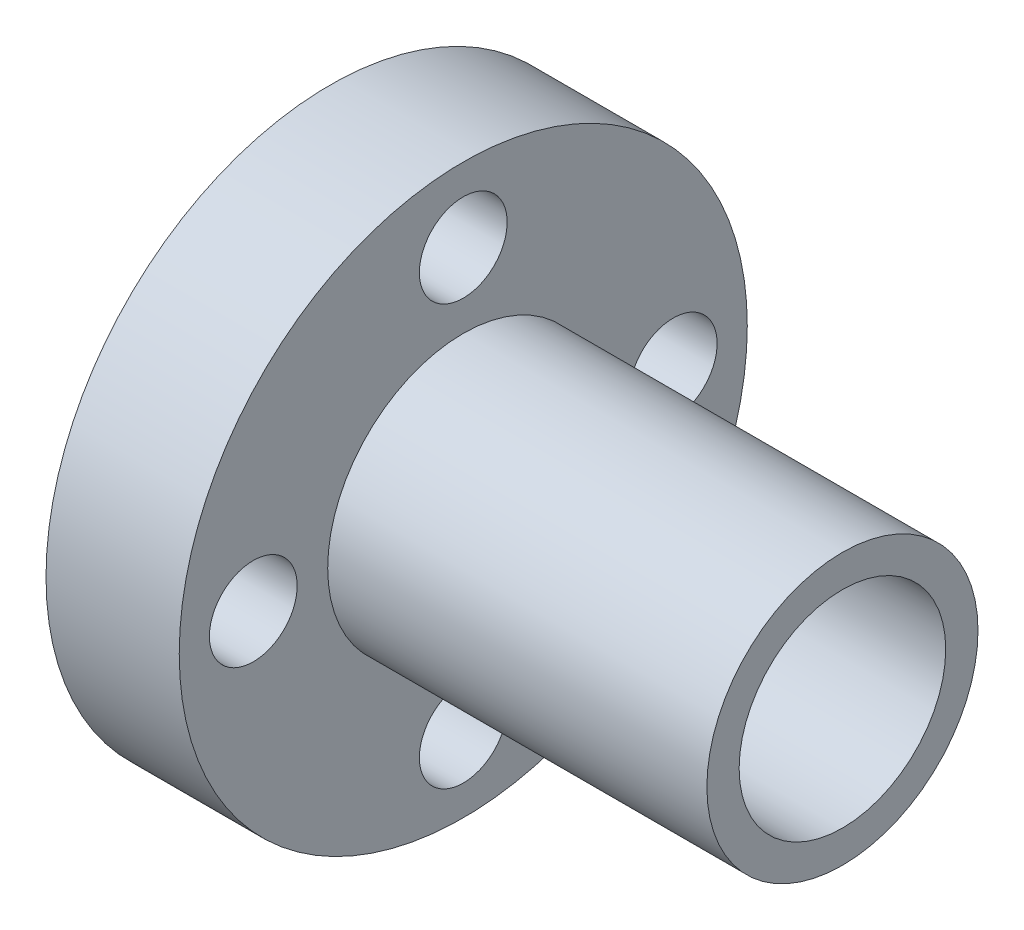
ISO-10303-21;
HEADER;
FILE_DESCRIPTION(('STEP AP214'),'2;1');
FILE_NAME('part.step','',(''),(''),'','','');
FILE_SCHEMA(('AUTOMOTIVE_DESIGN { 1 0 10303 214 1 1 1 1 }'));
ENDSEC;
DATA;
#1=APPLICATION_CONTEXT('core data for automotive mechanical design processes');
#2=APPLICATION_PROTOCOL_DEFINITION('international standard','automotive_design',2000,#1);
#3=PRODUCT_CONTEXT('',#1,'mechanical');
#4=PRODUCT('Part','Part','',(#3));
#5=PRODUCT_RELATED_PRODUCT_CATEGORY('part','',(#4));
#6=PRODUCT_DEFINITION_FORMATION('','',#4);
#7=PRODUCT_DEFINITION_CONTEXT('part definition',#1,'design');
#8=PRODUCT_DEFINITION('design','',#6,#7);
#9=PRODUCT_DEFINITION_SHAPE('','',#8);
#10=(LENGTH_UNIT() NAMED_UNIT(*) SI_UNIT(.MILLI.,.METRE.));
#11=(NAMED_UNIT(*) PLANE_ANGLE_UNIT() SI_UNIT($,.RADIAN.));
#12=(NAMED_UNIT(*) SI_UNIT($,.STERADIAN.) SOLID_ANGLE_UNIT());
#13=UNCERTAINTY_MEASURE_WITH_UNIT(LENGTH_MEASURE(1.E-05),#10,'distance_accuracy_value','');
#14=(GEOMETRIC_REPRESENTATION_CONTEXT(3) GLOBAL_UNCERTAINTY_ASSIGNED_CONTEXT((#13)) GLOBAL_UNIT_ASSIGNED_CONTEXT((#10,
#11,#12)) REPRESENTATION_CONTEXT('',''));
#15=CARTESIAN_POINT('',(0.,0.,0.));
#16=DIRECTION('',(0.,0.,1.));
#17=DIRECTION('',(1.,0.,0.));
#18=AXIS2_PLACEMENT_3D('',#15,#16,#17);
#19=CARTESIAN_POINT('',(5.159375,0.,0.));
#20=DIRECTION('',(1.,0.,0.));
#21=DIRECTION('',(0.,0.,-1.));
#22=AXIS2_PLACEMENT_3D('',#19,#20,#21);
#23=PLANE('',#22);
#24=CARTESIAN_POINT('',(5.159375,-8.1315,0.));
#25=DIRECTION('',(1.,0.,0.));
#26=DIRECTION('',(0.,0.,-1.));
#27=AXIS2_PLACEMENT_3D('',#24,#25,#26);
#28=CIRCLE('',#27,1.7);
#29=CARTESIAN_POINT('',(5.159375,-8.1315,1.7));
#30=VERTEX_POINT('',#29);
#31=EDGE_CURVE('E61',#30,#30,#28,.T.);
#32=ORIENTED_EDGE('',*,*,#31,.F.);
#33=EDGE_LOOP('',(#32));
#34=FACE_BOUND('',#33,.T.);
#35=CARTESIAN_POINT('',(5.159375,8.1315,0.));
#36=DIRECTION('',(1.,0.,0.));
#37=DIRECTION('',(0.,0.,-1.));
#38=AXIS2_PLACEMENT_3D('',#35,#36,#37);
#39=CIRCLE('',#38,1.7);
#40=CARTESIAN_POINT('',(5.159375,8.1315,1.7));
#41=VERTEX_POINT('',#40);
#42=EDGE_CURVE('E49',#41,#41,#39,.T.);
#43=ORIENTED_EDGE('',*,*,#42,.F.);
#44=EDGE_LOOP('',(#43));
#45=FACE_BOUND('',#44,.T.);
#46=CARTESIAN_POINT('',(5.159375,0.,0.));
#47=DIRECTION('',(1.,0.,0.));
#48=DIRECTION('',(0.,0.,-1.));
#49=AXIS2_PLACEMENT_3D('',#46,#47,#48);
#50=CIRCLE('',#49,5.25);
#51=CARTESIAN_POINT('',(5.159375,0.,5.25));
#52=VERTEX_POINT('',#51);
#53=EDGE_CURVE('E10',#52,#52,#50,.T.);
#54=ORIENTED_EDGE('',*,*,#53,.F.);
#55=EDGE_LOOP('',(#54));
#56=FACE_BOUND('',#55,.T.);
#57=CARTESIAN_POINT('',(5.159375,0.,0.));
#58=DIRECTION('',(1.,0.,0.));
#59=DIRECTION('',(0.,0.,-1.));
#60=AXIS2_PLACEMENT_3D('',#57,#58,#59);
#61=CIRCLE('',#60,11.);
#62=CARTESIAN_POINT('',(5.159375,0.,-11.));
#63=VERTEX_POINT('',#62);
#64=EDGE_CURVE('E40',#63,#63,#61,.T.);
#65=ORIENTED_EDGE('',*,*,#64,.T.);
#66=EDGE_LOOP('',(#65));
#67=FACE_BOUND('',#66,.T.);
#68=CARTESIAN_POINT('',(5.159375,0.,-8.1315));
#69=DIRECTION('',(1.,0.,0.));
#70=DIRECTION('',(0.,0.,-1.));
#71=AXIS2_PLACEMENT_3D('',#68,#69,#70);
#72=CIRCLE('',#71,1.7);
#73=CARTESIAN_POINT('',(5.159375,0.,-6.4315));
#74=VERTEX_POINT('',#73);
#75=EDGE_CURVE('E55',#74,#74,#72,.T.);
#76=ORIENTED_EDGE('',*,*,#75,.F.);
#77=EDGE_LOOP('',(#76));
#78=FACE_BOUND('',#77,.T.);
#79=CARTESIAN_POINT('',(5.159375,0.,8.1315));
#80=DIRECTION('',(1.,0.,0.));
#81=DIRECTION('',(0.,0.,-1.));
#82=AXIS2_PLACEMENT_3D('',#79,#80,#81);
#83=CIRCLE('',#82,1.7);
#84=CARTESIAN_POINT('',(5.159375,0.,9.8315));
#85=VERTEX_POINT('',#84);
#86=EDGE_CURVE('E67',#85,#85,#83,.T.);
#87=ORIENTED_EDGE('',*,*,#86,.F.);
#88=EDGE_LOOP('',(#87));
#89=FACE_BOUND('',#88,.T.);
#90=ADVANCED_FACE('F32',(#34,#45,#56,#67,#78,#89),#23,.T.);
#91=CARTESIAN_POINT('',(0.,0.,0.));
#92=DIRECTION('',(1.,0.,0.));
#93=DIRECTION('',(0.,0.,-1.));
#94=AXIS2_PLACEMENT_3D('',#91,#92,#93);
#95=PLANE('',#94);
#96=CARTESIAN_POINT('',(0.,0.,0.));
#97=DIRECTION('',(1.,0.,0.));
#98=DIRECTION('',(0.,0.,-1.));
#99=AXIS2_PLACEMENT_3D('',#96,#97,#98);
#100=CIRCLE('',#99,4.0005);
#101=CARTESIAN_POINT('',(0.,0.,-4.0005));
#102=VERTEX_POINT('',#101);
#103=EDGE_CURVE('E73',#102,#102,#100,.T.);
#104=ORIENTED_EDGE('',*,*,#103,.T.);
#105=EDGE_LOOP('',(#104));
#106=FACE_BOUND('',#105,.T.);
#107=CARTESIAN_POINT('',(0.,0.,0.));
#108=DIRECTION('',(1.,0.,0.));
#109=DIRECTION('',(0.,0.,-1.));
#110=AXIS2_PLACEMENT_3D('',#107,#108,#109);
#111=CIRCLE('',#110,11.);
#112=CARTESIAN_POINT('',(0.,0.,-11.));
#113=VERTEX_POINT('',#112);
#114=EDGE_CURVE('E36',#113,#113,#111,.T.);
#115=ORIENTED_EDGE('',*,*,#114,.F.);
#116=EDGE_LOOP('',(#115));
#117=FACE_BOUND('',#116,.T.);
#118=CARTESIAN_POINT('',(0.,8.1315,0.));
#119=DIRECTION('',(1.,0.,0.));
#120=DIRECTION('',(0.,0.,-1.));
#121=AXIS2_PLACEMENT_3D('',#118,#119,#120);
#122=CIRCLE('',#121,1.7);
#123=CARTESIAN_POINT('',(0.,8.1315,1.7));
#124=VERTEX_POINT('',#123);
#125=EDGE_CURVE('E52',#124,#124,#122,.T.);
#126=ORIENTED_EDGE('',*,*,#125,.T.);
#127=EDGE_LOOP('',(#126));
#128=FACE_BOUND('',#127,.T.);
#129=CARTESIAN_POINT('',(0.,0.,-8.1315));
#130=DIRECTION('',(1.,0.,0.));
#131=DIRECTION('',(0.,-1.,0.));
#132=AXIS2_PLACEMENT_3D('',#129,#130,#131);
#133=CIRCLE('',#132,1.7);
#134=CARTESIAN_POINT('',(0.,0.,-6.4315));
#135=VERTEX_POINT('',#134);
#136=EDGE_CURVE('E58',#135,#135,#133,.T.);
#137=ORIENTED_EDGE('',*,*,#136,.T.);
#138=EDGE_LOOP('',(#137));
#139=FACE_BOUND('',#138,.T.);
#140=CARTESIAN_POINT('',(0.,-8.1315,0.));
#141=DIRECTION('',(1.,0.,0.));
#142=DIRECTION('',(0.,0.,1.));
#143=AXIS2_PLACEMENT_3D('',#140,#141,#142);
#144=CIRCLE('',#143,1.7);
#145=CARTESIAN_POINT('',(0.,-8.1315,1.7));
#146=VERTEX_POINT('',#145);
#147=EDGE_CURVE('E64',#146,#146,#144,.T.);
#148=ORIENTED_EDGE('',*,*,#147,.T.);
#149=EDGE_LOOP('',(#148));
#150=FACE_BOUND('',#149,.T.);
#151=CARTESIAN_POINT('',(0.,0.,8.1315));
#152=DIRECTION('',(1.,0.,0.));
#153=DIRECTION('',(0.,1.,0.));
#154=AXIS2_PLACEMENT_3D('',#151,#152,#153);
#155=CIRCLE('',#154,1.7);
#156=CARTESIAN_POINT('',(0.,0.,9.8315));
#157=VERTEX_POINT('',#156);
#158=EDGE_CURVE('E70',#157,#157,#155,.T.);
#159=ORIENTED_EDGE('',*,*,#158,.T.);
#160=EDGE_LOOP('',(#159));
#161=FACE_BOUND('',#160,.T.);
#162=ADVANCED_FACE('F80',(#106,#117,#128,#139,#150,#161),#95,.F.);
#163=CARTESIAN_POINT('',(5.159375,0.,0.));
#164=DIRECTION('',(-1.,0.,0.));
#165=DIRECTION('',(0.,0.,1.));
#166=AXIS2_PLACEMENT_3D('',#163,#164,#165);
#167=CYLINDRICAL_SURFACE('',#166,11.);
#168=ORIENTED_EDGE('',*,*,#64,.F.);
#169=EDGE_LOOP('',(#168));
#170=FACE_BOUND('',#169,.T.);
#171=ORIENTED_EDGE('',*,*,#114,.T.);
#172=EDGE_LOOP('',(#171));
#173=FACE_BOUND('',#172,.T.);
#174=ADVANCED_FACE('F34',(#170,#173),#167,.T.);
#175=CARTESIAN_POINT('',(19.84375,0.,0.));
#176=DIRECTION('',(-1.,0.,0.));
#177=DIRECTION('',(0.,0.,1.));
#178=AXIS2_PLACEMENT_3D('',#175,#176,#177);
#179=CYLINDRICAL_SURFACE('',#178,5.25);
#180=CARTESIAN_POINT('',(19.84375,0.,0.));
#181=DIRECTION('',(-1.,0.,0.));
#182=DIRECTION('',(0.,0.,1.));
#183=AXIS2_PLACEMENT_3D('',#180,#181,#182);
#184=CIRCLE('',#183,5.25);
#185=CARTESIAN_POINT('',(19.84375,0.,5.25));
#186=VERTEX_POINT('',#185);
#187=EDGE_CURVE('E46',#186,#186,#184,.T.);
#188=CARTESIAN_POINT('',(5.159375,0.,5.25));
#189=CARTESIAN_POINT('',(5.31233723958333,0.,5.25));
#190=CARTESIAN_POINT('',(5.46529947916667,0.,5.25));
#191=CARTESIAN_POINT('',(5.77122395833333,0.,5.25));
#192=CARTESIAN_POINT('',(5.92418619791667,0.,5.25));
#193=CARTESIAN_POINT('',(6.23011067708333,0.,5.25));
#194=CARTESIAN_POINT('',(6.38307291666667,0.,5.25));
#195=CARTESIAN_POINT('',(6.68899739583333,0.,5.25));
#196=CARTESIAN_POINT('',(6.84195963541667,0.,5.25));
#197=CARTESIAN_POINT('',(7.14788411458333,0.,5.25));
#198=CARTESIAN_POINT('',(7.30084635416667,0.,5.25));
#199=CARTESIAN_POINT('',(7.60677083333333,0.,5.25));
#200=CARTESIAN_POINT('',(7.75973307291667,0.,5.25));
#201=CARTESIAN_POINT('',(8.06565755208333,0.,5.25));
#202=CARTESIAN_POINT('',(8.21861979166667,0.,5.25));
#203=CARTESIAN_POINT('',(8.52454427083333,0.,5.25));
#204=CARTESIAN_POINT('',(8.67750651041667,0.,5.25));
#205=CARTESIAN_POINT('',(8.98343098958333,0.,5.25));
#206=CARTESIAN_POINT('',(9.13639322916667,0.,5.25));
#207=CARTESIAN_POINT('',(9.44231770833333,0.,5.25));
#208=CARTESIAN_POINT('',(9.59527994791667,0.,5.25));
#209=CARTESIAN_POINT('',(9.90120442708333,0.,5.25));
#210=CARTESIAN_POINT('',(10.0541666666667,0.,5.25));
#211=CARTESIAN_POINT('',(10.3600911458333,0.,5.25));
#212=CARTESIAN_POINT('',(10.5130533854167,0.,5.25));
#213=CARTESIAN_POINT('',(10.8189778645833,0.,5.25));
#214=CARTESIAN_POINT('',(10.9719401041667,0.,5.25));
#215=CARTESIAN_POINT('',(11.2778645833333,0.,5.25));
#216=CARTESIAN_POINT('',(11.4308268229167,0.,5.25));
#217=CARTESIAN_POINT('',(11.7367513020833,0.,5.25));
#218=CARTESIAN_POINT('',(11.8897135416667,0.,5.25));
#219=CARTESIAN_POINT('',(12.1956380208333,0.,5.25));
#220=CARTESIAN_POINT('',(12.3486002604167,0.,5.25));
#221=CARTESIAN_POINT('',(12.6545247395833,0.,5.25));
#222=CARTESIAN_POINT('',(12.8074869791667,0.,5.25));
#223=CARTESIAN_POINT('',(13.1134114583333,0.,5.25));
#224=CARTESIAN_POINT('',(13.2663736979167,0.,5.25));
#225=CARTESIAN_POINT('',(13.5722981770833,0.,5.25));
#226=CARTESIAN_POINT('',(13.7252604166667,0.,5.25));
#227=CARTESIAN_POINT('',(14.0311848958333,0.,5.25));
#228=CARTESIAN_POINT('',(14.1841471354167,0.,5.25));
#229=CARTESIAN_POINT('',(14.4900716145833,0.,5.25));
#230=CARTESIAN_POINT('',(14.6430338541667,0.,5.25));
#231=CARTESIAN_POINT('',(14.9489583333333,0.,5.25));
#232=CARTESIAN_POINT('',(15.1019205729167,0.,5.25));
#233=CARTESIAN_POINT('',(15.4078450520833,0.,5.25));
#234=CARTESIAN_POINT('',(15.5608072916667,0.,5.25));
#235=CARTESIAN_POINT('',(15.8667317708333,0.,5.25));
#236=CARTESIAN_POINT('',(16.0196940104167,0.,5.25));
#237=CARTESIAN_POINT('',(16.3256184895833,0.,5.25));
#238=CARTESIAN_POINT('',(16.4785807291667,0.,5.25));
#239=CARTESIAN_POINT('',(16.7845052083333,0.,5.25));
#240=CARTESIAN_POINT('',(16.9374674479167,0.,5.25));
#241=CARTESIAN_POINT('',(17.2433919270833,0.,5.25));
#242=CARTESIAN_POINT('',(17.3963541666667,0.,5.25));
#243=CARTESIAN_POINT('',(17.7022786458333,0.,5.25));
#244=CARTESIAN_POINT('',(17.8552408854167,0.,5.25));
#245=CARTESIAN_POINT('',(18.1611653645833,0.,5.25));
#246=CARTESIAN_POINT('',(18.3141276041667,0.,5.25));
#247=CARTESIAN_POINT('',(18.6200520833333,0.,5.25));
#248=CARTESIAN_POINT('',(18.7730143229167,0.,5.25));
#249=CARTESIAN_POINT('',(19.0789388020833,0.,5.25));
#250=CARTESIAN_POINT('',(19.2319010416667,0.,5.25));
#251=CARTESIAN_POINT('',(19.5378255208333,0.,5.25));
#252=CARTESIAN_POINT('',(19.6907877604167,0.,5.25));
#253=CARTESIAN_POINT('',(19.84375,0.,5.25));
#254=B_SPLINE_CURVE_WITH_KNOTS('',3,(#188,#189,#190,#191,#192,#193,#194,#195,#196,#197,#198,
#199,#200,#201,#202,#203,#204,#205,#206,#207,#208,#209,#210,#211,#212,#213,#214,#215,#216,#217,
#218,#219,#220,#221,#222,#223,#224,#225,#226,#227,#228,#229,#230,#231,#232,#233,#234,#235,#236,
#237,#238,#239,#240,#241,#242,#243,#244,#245,#246,#247,#248,#249,#250,#251,#252,#253),
.UNSPECIFIED.,.F.,.F.,(4,2,2,2,2,2,2,2,2,2,2,2,2,2,2,2,2,2,2,2,2,2,2,2,2,2,2,2,2,2,2,2,4),(0.,
0.458886718750001,0.9177734375,1.37666015625,1.835546875,2.29443359375,2.7533203125,
3.21220703125,3.67109375,4.12998046875,4.5888671875,5.04775390625,5.506640625,5.96552734375,
6.4244140625,6.88330078125,7.3421875,7.80107421875,8.2599609375,8.71884765625,9.177734375,
9.63662109375,10.0955078125,10.55439453125,11.01328125,11.47216796875,11.9310546875,
12.38994140625,12.848828125,13.30771484375,13.7666015625,14.22548828125,14.684375),.UNSPECIFIED.);
#255=EDGE_CURVE('BSEAM94',#52,#186,#254,.T.);
#256=ORIENTED_EDGE('',*,*,#53,.T.);
#257=ORIENTED_EDGE('',*,*,#187,.T.);
#258=ORIENTED_EDGE('',*,*,#255,.T.);
#259=ORIENTED_EDGE('',*,*,#255,.F.);
#260=EDGE_LOOP('',(#256,#258,#257,#259));
#261=FACE_BOUND('',#260,.T.);
#262=ADVANCED_FACE('F94',(#261),#179,.T.);
#263=CARTESIAN_POINT('',(19.84375,0.,0.));
#264=DIRECTION('',(-1.,0.,0.));
#265=DIRECTION('',(0.,0.,1.));
#266=AXIS2_PLACEMENT_3D('',#263,#264,#265);
#267=PLANE('',#266);
#268=CARTESIAN_POINT('',(19.84375,0.,0.));
#269=DIRECTION('',(1.,0.,0.));
#270=DIRECTION('',(0.,0.,-1.));
#271=AXIS2_PLACEMENT_3D('',#268,#269,#270);
#272=CIRCLE('',#271,4.0005);
#273=CARTESIAN_POINT('',(19.84375,0.,-4.0005));
#274=VERTEX_POINT('',#273);
#275=EDGE_CURVE('E74',#274,#274,#272,.T.);
#276=ORIENTED_EDGE('',*,*,#275,.F.);
#277=EDGE_LOOP('',(#276));
#278=FACE_BOUND('',#277,.T.);
#279=ORIENTED_EDGE('',*,*,#187,.F.);
#280=EDGE_LOOP('',(#279));
#281=FACE_BOUND('',#280,.T.);
#282=ADVANCED_FACE('F90',(#278,#281),#267,.F.);
#283=CARTESIAN_POINT('',(9.96770111206852,8.1315,0.));
#284=DIRECTION('',(-1.,0.,0.));
#285=DIRECTION('',(0.,0.,1.));
#286=AXIS2_PLACEMENT_3D('',#283,#284,#285);
#287=CYLINDRICAL_SURFACE('',#286,1.7);
#288=CARTESIAN_POINT('',(0.,8.1315,1.7));
#289=CARTESIAN_POINT('',(0.0537434895833317,8.1315,1.7));
#290=CARTESIAN_POINT('',(0.107486979166665,8.1315,1.7));
#291=CARTESIAN_POINT('',(0.214973958333332,8.1315,1.7));
#292=CARTESIAN_POINT('',(0.268717447916665,8.1315,1.7));
#293=CARTESIAN_POINT('',(0.376204427083331,8.1315,1.7));
#294=CARTESIAN_POINT('',(0.429947916666665,8.1315,1.7));
#295=CARTESIAN_POINT('',(0.537434895833332,8.1315,1.7));
#296=CARTESIAN_POINT('',(0.591178385416666,8.1315,1.7));
#297=CARTESIAN_POINT('',(0.698665364583332,8.1315,1.7));
#298=CARTESIAN_POINT('',(0.752408854166665,8.1315,1.7));
#299=CARTESIAN_POINT('',(0.859895833333332,8.1315,1.7));
#300=CARTESIAN_POINT('',(0.913639322916665,8.1315,1.7));
#301=CARTESIAN_POINT('',(1.02112630208333,8.1315,1.7));
#302=CARTESIAN_POINT('',(1.07486979166667,8.1315,1.7));
#303=CARTESIAN_POINT('',(1.18235677083333,8.1315,1.7));
#304=CARTESIAN_POINT('',(1.23610026041667,8.1315,1.7));
#305=CARTESIAN_POINT('',(1.34358723958333,8.1315,1.7));
#306=CARTESIAN_POINT('',(1.39733072916667,8.1315,1.7));
#307=CARTESIAN_POINT('',(1.50481770833333,8.1315,1.7));
#308=CARTESIAN_POINT('',(1.55856119791666,8.1315,1.7));
#309=CARTESIAN_POINT('',(1.66604817708333,8.1315,1.7));
#310=CARTESIAN_POINT('',(1.71979166666667,8.1315,1.7));
#311=CARTESIAN_POINT('',(1.82727864583333,8.1315,1.7));
#312=CARTESIAN_POINT('',(1.88102213541667,8.1315,1.7));
#313=CARTESIAN_POINT('',(1.98850911458333,8.1315,1.7));
#314=CARTESIAN_POINT('',(2.04225260416667,8.1315,1.7));
#315=CARTESIAN_POINT('',(2.14973958333333,8.1315,1.7));
#316=CARTESIAN_POINT('',(2.20348307291667,8.1315,1.7));
#317=CARTESIAN_POINT('',(2.31097005208333,8.1315,1.7));
#318=CARTESIAN_POINT('',(2.36471354166666,8.1315,1.7));
#319=CARTESIAN_POINT('',(2.47220052083333,8.1315,1.7));
#320=CARTESIAN_POINT('',(2.52594401041667,8.1315,1.7));
#321=CARTESIAN_POINT('',(2.63343098958333,8.1315,1.7));
#322=CARTESIAN_POINT('',(2.68717447916667,8.1315,1.7));
#323=CARTESIAN_POINT('',(2.79466145833333,8.1315,1.7));
#324=CARTESIAN_POINT('',(2.84840494791667,8.1315,1.7));
#325=CARTESIAN_POINT('',(2.95589192708333,8.1315,1.7));
#326=CARTESIAN_POINT('',(3.00963541666667,8.1315,1.7));
#327=CARTESIAN_POINT('',(3.11712239583333,8.1315,1.7));
#328=CARTESIAN_POINT('',(3.17086588541667,8.1315,1.7));
#329=CARTESIAN_POINT('',(3.27835286458333,8.1315,1.7));
#330=CARTESIAN_POINT('',(3.33209635416667,8.1315,1.7));
#331=CARTESIAN_POINT('',(3.43958333333333,8.1315,1.7));
#332=CARTESIAN_POINT('',(3.49332682291667,8.1315,1.7));
#333=CARTESIAN_POINT('',(3.60081380208333,8.1315,1.7));
#334=CARTESIAN_POINT('',(3.65455729166667,8.1315,1.7));
#335=CARTESIAN_POINT('',(3.76204427083333,8.1315,1.7));
#336=CARTESIAN_POINT('',(3.81578776041667,8.1315,1.7));
#337=CARTESIAN_POINT('',(3.92327473958333,8.1315,1.7));
#338=CARTESIAN_POINT('',(3.97701822916667,8.1315,1.7));
#339=CARTESIAN_POINT('',(4.08450520833333,8.1315,1.7));
#340=CARTESIAN_POINT('',(4.13824869791667,8.1315,1.7));
#341=CARTESIAN_POINT('',(4.24573567708333,8.1315,1.7));
#342=CARTESIAN_POINT('',(4.29947916666667,8.1315,1.7));
#343=CARTESIAN_POINT('',(4.40696614583333,8.1315,1.7));
#344=CARTESIAN_POINT('',(4.46070963541667,8.1315,1.7));
#345=CARTESIAN_POINT('',(4.56819661458333,8.1315,1.7));
#346=CARTESIAN_POINT('',(4.62194010416667,8.1315,1.7));
#347=CARTESIAN_POINT('',(4.72942708333333,8.1315,1.7));
#348=CARTESIAN_POINT('',(4.78317057291667,8.1315,1.7));
#349=CARTESIAN_POINT('',(4.89065755208333,8.1315,1.7));
#350=CARTESIAN_POINT('',(4.94440104166667,8.1315,1.7));
#351=CARTESIAN_POINT('',(5.05188802083333,8.1315,1.7));
#352=CARTESIAN_POINT('',(5.10563151041667,8.1315,1.7));
#353=CARTESIAN_POINT('',(5.159375,8.1315,1.7));
#354=B_SPLINE_CURVE_WITH_KNOTS('',3,(#288,#289,#290,#291,#292,#293,#294,#295,#296,#297,#298,
#299,#300,#301,#302,#303,#304,#305,#306,#307,#308,#309,#310,#311,#312,#313,#314,#315,#316,#317,
#318,#319,#320,#321,#322,#323,#324,#325,#326,#327,#328,#329,#330,#331,#332,#333,#334,#335,#336,
#337,#338,#339,#340,#341,#342,#343,#344,#345,#346,#347,#348,#349,#350,#351,#352,#353),
.UNSPECIFIED.,.F.,.F.,(4,2,2,2,2,2,2,2,2,2,2,2,2,2,2,2,2,2,2,2,2,2,2,2,2,2,2,2,2,2,2,2,4),(0.,
0.161230468750001,0.3224609375,0.48369140625,0.644921875000001,0.80615234375,0.967382812500001,
1.12861328125,1.28984375,1.45107421875,1.6123046875,1.77353515625,1.934765625,2.09599609375,
2.2572265625,2.41845703125,2.5796875,2.74091796875,2.9021484375,3.06337890625,3.224609375,
3.38583984375,3.5470703125,3.70830078125,3.86953125,4.03076171875,4.1919921875,4.35322265625,
4.514453125,4.67568359375,4.8369140625,4.99814453125,5.159375),.UNSPECIFIED.);
#355=EDGE_CURVE('BSEAM93',#124,#41,#354,.T.);
#356=ORIENTED_EDGE('',*,*,#125,.F.);
#357=ORIENTED_EDGE('',*,*,#42,.T.);
#358=ORIENTED_EDGE('',*,*,#355,.T.);
#359=ORIENTED_EDGE('',*,*,#355,.F.);
#360=EDGE_LOOP('',(#356,#358,#357,#359));
#361=FACE_BOUND('',#360,.T.);
#362=ADVANCED_FACE('F93',(#361),#287,.F.);
#363=CARTESIAN_POINT('',(9.96770111206852,0.,-8.1315));
#364=DIRECTION('',(-1.,0.,0.));
#365=DIRECTION('',(0.,0.,1.));
#366=AXIS2_PLACEMENT_3D('',#363,#364,#365);
#367=CYLINDRICAL_SURFACE('',#366,1.7);
#368=CARTESIAN_POINT('',(0.,0.,-6.4315));
#369=CARTESIAN_POINT('',(0.0537434895833317,0.,-6.4315));
#370=CARTESIAN_POINT('',(0.107486979166665,0.,-6.4315));
#371=CARTESIAN_POINT('',(0.214973958333332,0.,-6.4315));
#372=CARTESIAN_POINT('',(0.268717447916665,0.,-6.4315));
#373=CARTESIAN_POINT('',(0.376204427083331,0.,-6.4315));
#374=CARTESIAN_POINT('',(0.429947916666665,0.,-6.4315));
#375=CARTESIAN_POINT('',(0.537434895833332,0.,-6.4315));
#376=CARTESIAN_POINT('',(0.591178385416666,0.,-6.4315));
#377=CARTESIAN_POINT('',(0.698665364583332,0.,-6.4315));
#378=CARTESIAN_POINT('',(0.752408854166665,0.,-6.4315));
#379=CARTESIAN_POINT('',(0.859895833333332,0.,-6.4315));
#380=CARTESIAN_POINT('',(0.913639322916665,0.,-6.4315));
#381=CARTESIAN_POINT('',(1.02112630208333,0.,-6.4315));
#382=CARTESIAN_POINT('',(1.07486979166667,0.,-6.4315));
#383=CARTESIAN_POINT('',(1.18235677083333,0.,-6.4315));
#384=CARTESIAN_POINT('',(1.23610026041667,0.,-6.4315));
#385=CARTESIAN_POINT('',(1.34358723958333,0.,-6.4315));
#386=CARTESIAN_POINT('',(1.39733072916667,0.,-6.4315));
#387=CARTESIAN_POINT('',(1.50481770833333,0.,-6.4315));
#388=CARTESIAN_POINT('',(1.55856119791666,0.,-6.4315));
#389=CARTESIAN_POINT('',(1.66604817708333,0.,-6.4315));
#390=CARTESIAN_POINT('',(1.71979166666667,0.,-6.4315));
#391=CARTESIAN_POINT('',(1.82727864583333,0.,-6.4315));
#392=CARTESIAN_POINT('',(1.88102213541667,0.,-6.4315));
#393=CARTESIAN_POINT('',(1.98850911458333,0.,-6.4315));
#394=CARTESIAN_POINT('',(2.04225260416667,0.,-6.4315));
#395=CARTESIAN_POINT('',(2.14973958333333,0.,-6.4315));
#396=CARTESIAN_POINT('',(2.20348307291667,0.,-6.4315));
#397=CARTESIAN_POINT('',(2.31097005208333,0.,-6.4315));
#398=CARTESIAN_POINT('',(2.36471354166666,0.,-6.4315));
#399=CARTESIAN_POINT('',(2.47220052083333,0.,-6.4315));
#400=CARTESIAN_POINT('',(2.52594401041667,0.,-6.4315));
#401=CARTESIAN_POINT('',(2.63343098958333,0.,-6.4315));
#402=CARTESIAN_POINT('',(2.68717447916667,0.,-6.4315));
#403=CARTESIAN_POINT('',(2.79466145833333,0.,-6.4315));
#404=CARTESIAN_POINT('',(2.84840494791667,0.,-6.4315));
#405=CARTESIAN_POINT('',(2.95589192708333,0.,-6.4315));
#406=CARTESIAN_POINT('',(3.00963541666667,0.,-6.4315));
#407=CARTESIAN_POINT('',(3.11712239583333,0.,-6.4315));
#408=CARTESIAN_POINT('',(3.17086588541667,0.,-6.4315));
#409=CARTESIAN_POINT('',(3.27835286458333,0.,-6.4315));
#410=CARTESIAN_POINT('',(3.33209635416667,0.,-6.4315));
#411=CARTESIAN_POINT('',(3.43958333333333,0.,-6.4315));
#412=CARTESIAN_POINT('',(3.49332682291667,0.,-6.4315));
#413=CARTESIAN_POINT('',(3.60081380208333,0.,-6.4315));
#414=CARTESIAN_POINT('',(3.65455729166667,0.,-6.4315));
#415=CARTESIAN_POINT('',(3.76204427083333,0.,-6.4315));
#416=CARTESIAN_POINT('',(3.81578776041667,0.,-6.4315));
#417=CARTESIAN_POINT('',(3.92327473958333,0.,-6.4315));
#418=CARTESIAN_POINT('',(3.97701822916667,0.,-6.4315));
#419=CARTESIAN_POINT('',(4.08450520833333,0.,-6.4315));
#420=CARTESIAN_POINT('',(4.13824869791667,0.,-6.4315));
#421=CARTESIAN_POINT('',(4.24573567708333,0.,-6.4315));
#422=CARTESIAN_POINT('',(4.29947916666667,0.,-6.4315));
#423=CARTESIAN_POINT('',(4.40696614583333,0.,-6.4315));
#424=CARTESIAN_POINT('',(4.46070963541667,0.,-6.4315));
#425=CARTESIAN_POINT('',(4.56819661458333,0.,-6.4315));
#426=CARTESIAN_POINT('',(4.62194010416667,0.,-6.4315));
#427=CARTESIAN_POINT('',(4.72942708333333,0.,-6.4315));
#428=CARTESIAN_POINT('',(4.78317057291667,0.,-6.4315));
#429=CARTESIAN_POINT('',(4.89065755208333,0.,-6.4315));
#430=CARTESIAN_POINT('',(4.94440104166667,0.,-6.4315));
#431=CARTESIAN_POINT('',(5.05188802083333,0.,-6.4315));
#432=CARTESIAN_POINT('',(5.10563151041667,0.,-6.4315));
#433=CARTESIAN_POINT('',(5.159375,0.,-6.4315));
#434=B_SPLINE_CURVE_WITH_KNOTS('',3,(#368,#369,#370,#371,#372,#373,#374,#375,#376,#377,#378,
#379,#380,#381,#382,#383,#384,#385,#386,#387,#388,#389,#390,#391,#392,#393,#394,#395,#396,#397,
#398,#399,#400,#401,#402,#403,#404,#405,#406,#407,#408,#409,#410,#411,#412,#413,#414,#415,#416,
#417,#418,#419,#420,#421,#422,#423,#424,#425,#426,#427,#428,#429,#430,#431,#432,#433),
.UNSPECIFIED.,.F.,.F.,(4,2,2,2,2,2,2,2,2,2,2,2,2,2,2,2,2,2,2,2,2,2,2,2,2,2,2,2,2,2,2,2,4),(0.,
0.161230468750001,0.3224609375,0.48369140625,0.644921875000001,0.80615234375,0.967382812500001,
1.12861328125,1.28984375,1.45107421875,1.6123046875,1.77353515625,1.934765625,2.09599609375,
2.2572265625,2.41845703125,2.5796875,2.74091796875,2.9021484375,3.06337890625,3.224609375,
3.38583984375,3.5470703125,3.70830078125,3.86953125,4.03076171875,4.1919921875,4.35322265625,
4.514453125,4.67568359375,4.8369140625,4.99814453125,5.159375),.UNSPECIFIED.);
#435=EDGE_CURVE('BSEAM128',#135,#74,#434,.T.);
#436=ORIENTED_EDGE('',*,*,#136,.F.);
#437=ORIENTED_EDGE('',*,*,#75,.T.);
#438=ORIENTED_EDGE('',*,*,#435,.T.);
#439=ORIENTED_EDGE('',*,*,#435,.F.);
#440=EDGE_LOOP('',(#436,#438,#437,#439));
#441=FACE_BOUND('',#440,.T.);
#442=ADVANCED_FACE('F128',(#441),#367,.F.);
#443=CARTESIAN_POINT('',(9.96770111206852,-8.1315,0.));
#444=DIRECTION('',(-1.,0.,0.));
#445=DIRECTION('',(0.,0.,1.));
#446=AXIS2_PLACEMENT_3D('',#443,#444,#445);
#447=CYLINDRICAL_SURFACE('',#446,1.7);
#448=CARTESIAN_POINT('',(0.,-8.1315,1.7));
#449=CARTESIAN_POINT('',(0.0537434895833317,-8.1315,1.7));
#450=CARTESIAN_POINT('',(0.107486979166665,-8.1315,1.7));
#451=CARTESIAN_POINT('',(0.214973958333332,-8.1315,1.7));
#452=CARTESIAN_POINT('',(0.268717447916665,-8.1315,1.7));
#453=CARTESIAN_POINT('',(0.376204427083331,-8.1315,1.7));
#454=CARTESIAN_POINT('',(0.429947916666665,-8.1315,1.7));
#455=CARTESIAN_POINT('',(0.537434895833332,-8.1315,1.7));
#456=CARTESIAN_POINT('',(0.591178385416666,-8.1315,1.7));
#457=CARTESIAN_POINT('',(0.698665364583332,-8.1315,1.7));
#458=CARTESIAN_POINT('',(0.752408854166665,-8.1315,1.7));
#459=CARTESIAN_POINT('',(0.859895833333332,-8.1315,1.7));
#460=CARTESIAN_POINT('',(0.913639322916665,-8.1315,1.7));
#461=CARTESIAN_POINT('',(1.02112630208333,-8.1315,1.7));
#462=CARTESIAN_POINT('',(1.07486979166667,-8.1315,1.7));
#463=CARTESIAN_POINT('',(1.18235677083333,-8.1315,1.7));
#464=CARTESIAN_POINT('',(1.23610026041667,-8.1315,1.7));
#465=CARTESIAN_POINT('',(1.34358723958333,-8.1315,1.7));
#466=CARTESIAN_POINT('',(1.39733072916667,-8.1315,1.7));
#467=CARTESIAN_POINT('',(1.50481770833333,-8.1315,1.7));
#468=CARTESIAN_POINT('',(1.55856119791666,-8.1315,1.7));
#469=CARTESIAN_POINT('',(1.66604817708333,-8.1315,1.7));
#470=CARTESIAN_POINT('',(1.71979166666667,-8.1315,1.7));
#471=CARTESIAN_POINT('',(1.82727864583333,-8.1315,1.7));
#472=CARTESIAN_POINT('',(1.88102213541667,-8.1315,1.7));
#473=CARTESIAN_POINT('',(1.98850911458333,-8.1315,1.7));
#474=CARTESIAN_POINT('',(2.04225260416667,-8.1315,1.7));
#475=CARTESIAN_POINT('',(2.14973958333333,-8.1315,1.7));
#476=CARTESIAN_POINT('',(2.20348307291667,-8.1315,1.7));
#477=CARTESIAN_POINT('',(2.31097005208333,-8.1315,1.7));
#478=CARTESIAN_POINT('',(2.36471354166666,-8.1315,1.7));
#479=CARTESIAN_POINT('',(2.47220052083333,-8.1315,1.7));
#480=CARTESIAN_POINT('',(2.52594401041667,-8.1315,1.7));
#481=CARTESIAN_POINT('',(2.63343098958333,-8.1315,1.7));
#482=CARTESIAN_POINT('',(2.68717447916667,-8.1315,1.7));
#483=CARTESIAN_POINT('',(2.79466145833333,-8.1315,1.7));
#484=CARTESIAN_POINT('',(2.84840494791667,-8.1315,1.7));
#485=CARTESIAN_POINT('',(2.95589192708333,-8.1315,1.7));
#486=CARTESIAN_POINT('',(3.00963541666667,-8.1315,1.7));
#487=CARTESIAN_POINT('',(3.11712239583333,-8.1315,1.7));
#488=CARTESIAN_POINT('',(3.17086588541667,-8.1315,1.7));
#489=CARTESIAN_POINT('',(3.27835286458333,-8.1315,1.7));
#490=CARTESIAN_POINT('',(3.33209635416667,-8.1315,1.7));
#491=CARTESIAN_POINT('',(3.43958333333333,-8.1315,1.7));
#492=CARTESIAN_POINT('',(3.49332682291667,-8.1315,1.7));
#493=CARTESIAN_POINT('',(3.60081380208333,-8.1315,1.7));
#494=CARTESIAN_POINT('',(3.65455729166667,-8.1315,1.7));
#495=CARTESIAN_POINT('',(3.76204427083333,-8.1315,1.7));
#496=CARTESIAN_POINT('',(3.81578776041667,-8.1315,1.7));
#497=CARTESIAN_POINT('',(3.92327473958333,-8.1315,1.7));
#498=CARTESIAN_POINT('',(3.97701822916667,-8.1315,1.7));
#499=CARTESIAN_POINT('',(4.08450520833333,-8.1315,1.7));
#500=CARTESIAN_POINT('',(4.13824869791667,-8.1315,1.7));
#501=CARTESIAN_POINT('',(4.24573567708333,-8.1315,1.7));
#502=CARTESIAN_POINT('',(4.29947916666667,-8.1315,1.7));
#503=CARTESIAN_POINT('',(4.40696614583333,-8.1315,1.7));
#504=CARTESIAN_POINT('',(4.46070963541667,-8.1315,1.7));
#505=CARTESIAN_POINT('',(4.56819661458333,-8.1315,1.7));
#506=CARTESIAN_POINT('',(4.62194010416667,-8.1315,1.7));
#507=CARTESIAN_POINT('',(4.72942708333333,-8.1315,1.7));
#508=CARTESIAN_POINT('',(4.78317057291667,-8.1315,1.7));
#509=CARTESIAN_POINT('',(4.89065755208333,-8.1315,1.7));
#510=CARTESIAN_POINT('',(4.94440104166667,-8.1315,1.7));
#511=CARTESIAN_POINT('',(5.05188802083333,-8.1315,1.7));
#512=CARTESIAN_POINT('',(5.10563151041667,-8.1315,1.7));
#513=CARTESIAN_POINT('',(5.159375,-8.1315,1.7));
#514=B_SPLINE_CURVE_WITH_KNOTS('',3,(#448,#449,#450,#451,#452,#453,#454,#455,#456,#457,#458,
#459,#460,#461,#462,#463,#464,#465,#466,#467,#468,#469,#470,#471,#472,#473,#474,#475,#476,#477,
#478,#479,#480,#481,#482,#483,#484,#485,#486,#487,#488,#489,#490,#491,#492,#493,#494,#495,#496,
#497,#498,#499,#500,#501,#502,#503,#504,#505,#506,#507,#508,#509,#510,#511,#512,#513),
.UNSPECIFIED.,.F.,.F.,(4,2,2,2,2,2,2,2,2,2,2,2,2,2,2,2,2,2,2,2,2,2,2,2,2,2,2,2,2,2,2,2,4),(0.,
0.161230468750001,0.3224609375,0.48369140625,0.644921875000001,0.80615234375,0.967382812500001,
1.12861328125,1.28984375,1.45107421875,1.6123046875,1.77353515625,1.934765625,2.09599609375,
2.2572265625,2.41845703125,2.5796875,2.74091796875,2.9021484375,3.06337890625,3.224609375,
3.38583984375,3.5470703125,3.70830078125,3.86953125,4.03076171875,4.1919921875,4.35322265625,
4.514453125,4.67568359375,4.8369140625,4.99814453125,5.159375),.UNSPECIFIED.);
#515=EDGE_CURVE('BSEAM122',#146,#30,#514,.T.);
#516=ORIENTED_EDGE('',*,*,#147,.F.);
#517=ORIENTED_EDGE('',*,*,#31,.T.);
#518=ORIENTED_EDGE('',*,*,#515,.T.);
#519=ORIENTED_EDGE('',*,*,#515,.F.);
#520=EDGE_LOOP('',(#516,#518,#517,#519));
#521=FACE_BOUND('',#520,.T.);
#522=ADVANCED_FACE('F122',(#521),#447,.F.);
#523=CARTESIAN_POINT('',(9.96770111206852,0.,8.1315));
#524=DIRECTION('',(-1.,0.,0.));
#525=DIRECTION('',(0.,0.,1.));
#526=AXIS2_PLACEMENT_3D('',#523,#524,#525);
#527=CYLINDRICAL_SURFACE('',#526,1.7);
#528=CARTESIAN_POINT('',(0.,0.,9.8315));
#529=CARTESIAN_POINT('',(0.0537434895833317,0.,9.8315));
#530=CARTESIAN_POINT('',(0.107486979166665,0.,9.8315));
#531=CARTESIAN_POINT('',(0.214973958333332,0.,9.8315));
#532=CARTESIAN_POINT('',(0.268717447916665,0.,9.8315));
#533=CARTESIAN_POINT('',(0.376204427083331,0.,9.8315));
#534=CARTESIAN_POINT('',(0.429947916666665,0.,9.8315));
#535=CARTESIAN_POINT('',(0.537434895833332,0.,9.8315));
#536=CARTESIAN_POINT('',(0.591178385416666,0.,9.8315));
#537=CARTESIAN_POINT('',(0.698665364583332,0.,9.8315));
#538=CARTESIAN_POINT('',(0.752408854166665,0.,9.8315));
#539=CARTESIAN_POINT('',(0.859895833333332,0.,9.8315));
#540=CARTESIAN_POINT('',(0.913639322916665,0.,9.8315));
#541=CARTESIAN_POINT('',(1.02112630208333,0.,9.8315));
#542=CARTESIAN_POINT('',(1.07486979166667,0.,9.8315));
#543=CARTESIAN_POINT('',(1.18235677083333,0.,9.8315));
#544=CARTESIAN_POINT('',(1.23610026041667,0.,9.8315));
#545=CARTESIAN_POINT('',(1.34358723958333,0.,9.8315));
#546=CARTESIAN_POINT('',(1.39733072916667,0.,9.8315));
#547=CARTESIAN_POINT('',(1.50481770833333,0.,9.8315));
#548=CARTESIAN_POINT('',(1.55856119791666,0.,9.8315));
#549=CARTESIAN_POINT('',(1.66604817708333,0.,9.8315));
#550=CARTESIAN_POINT('',(1.71979166666667,0.,9.8315));
#551=CARTESIAN_POINT('',(1.82727864583333,0.,9.8315));
#552=CARTESIAN_POINT('',(1.88102213541667,0.,9.8315));
#553=CARTESIAN_POINT('',(1.98850911458333,0.,9.8315));
#554=CARTESIAN_POINT('',(2.04225260416667,0.,9.8315));
#555=CARTESIAN_POINT('',(2.14973958333333,0.,9.8315));
#556=CARTESIAN_POINT('',(2.20348307291667,0.,9.8315));
#557=CARTESIAN_POINT('',(2.31097005208333,0.,9.8315));
#558=CARTESIAN_POINT('',(2.36471354166666,0.,9.8315));
#559=CARTESIAN_POINT('',(2.47220052083333,0.,9.8315));
#560=CARTESIAN_POINT('',(2.52594401041667,0.,9.8315));
#561=CARTESIAN_POINT('',(2.63343098958333,0.,9.8315));
#562=CARTESIAN_POINT('',(2.68717447916667,0.,9.8315));
#563=CARTESIAN_POINT('',(2.79466145833333,0.,9.8315));
#564=CARTESIAN_POINT('',(2.84840494791667,0.,9.8315));
#565=CARTESIAN_POINT('',(2.95589192708333,0.,9.8315));
#566=CARTESIAN_POINT('',(3.00963541666667,0.,9.8315));
#567=CARTESIAN_POINT('',(3.11712239583333,0.,9.8315));
#568=CARTESIAN_POINT('',(3.17086588541667,0.,9.8315));
#569=CARTESIAN_POINT('',(3.27835286458333,0.,9.8315));
#570=CARTESIAN_POINT('',(3.33209635416667,0.,9.8315));
#571=CARTESIAN_POINT('',(3.43958333333333,0.,9.8315));
#572=CARTESIAN_POINT('',(3.49332682291667,0.,9.8315));
#573=CARTESIAN_POINT('',(3.60081380208333,0.,9.8315));
#574=CARTESIAN_POINT('',(3.65455729166667,0.,9.8315));
#575=CARTESIAN_POINT('',(3.76204427083333,0.,9.8315));
#576=CARTESIAN_POINT('',(3.81578776041667,0.,9.8315));
#577=CARTESIAN_POINT('',(3.92327473958333,0.,9.8315));
#578=CARTESIAN_POINT('',(3.97701822916667,0.,9.8315));
#579=CARTESIAN_POINT('',(4.08450520833333,0.,9.8315));
#580=CARTESIAN_POINT('',(4.13824869791667,0.,9.8315));
#581=CARTESIAN_POINT('',(4.24573567708333,0.,9.8315));
#582=CARTESIAN_POINT('',(4.29947916666667,0.,9.8315));
#583=CARTESIAN_POINT('',(4.40696614583333,0.,9.8315));
#584=CARTESIAN_POINT('',(4.46070963541667,0.,9.8315));
#585=CARTESIAN_POINT('',(4.56819661458333,0.,9.8315));
#586=CARTESIAN_POINT('',(4.62194010416667,0.,9.8315));
#587=CARTESIAN_POINT('',(4.72942708333333,0.,9.8315));
#588=CARTESIAN_POINT('',(4.78317057291667,0.,9.8315));
#589=CARTESIAN_POINT('',(4.89065755208333,0.,9.8315));
#590=CARTESIAN_POINT('',(4.94440104166667,0.,9.8315));
#591=CARTESIAN_POINT('',(5.05188802083333,0.,9.8315));
#592=CARTESIAN_POINT('',(5.10563151041667,0.,9.8315));
#593=CARTESIAN_POINT('',(5.159375,0.,9.8315));
#594=B_SPLINE_CURVE_WITH_KNOTS('',3,(#528,#529,#530,#531,#532,#533,#534,#535,#536,#537,#538,
#539,#540,#541,#542,#543,#544,#545,#546,#547,#548,#549,#550,#551,#552,#553,#554,#555,#556,#557,
#558,#559,#560,#561,#562,#563,#564,#565,#566,#567,#568,#569,#570,#571,#572,#573,#574,#575,#576,
#577,#578,#579,#580,#581,#582,#583,#584,#585,#586,#587,#588,#589,#590,#591,#592,#593),
.UNSPECIFIED.,.F.,.F.,(4,2,2,2,2,2,2,2,2,2,2,2,2,2,2,2,2,2,2,2,2,2,2,2,2,2,2,2,2,2,2,2,4),(0.,
0.161230468750001,0.3224609375,0.48369140625,0.644921875000001,0.80615234375,0.967382812500001,
1.12861328125,1.28984375,1.45107421875,1.6123046875,1.77353515625,1.934765625,2.09599609375,
2.2572265625,2.41845703125,2.5796875,2.74091796875,2.9021484375,3.06337890625,3.224609375,
3.38583984375,3.5470703125,3.70830078125,3.86953125,4.03076171875,4.1919921875,4.35322265625,
4.514453125,4.67568359375,4.8369140625,4.99814453125,5.159375),.UNSPECIFIED.);
#595=EDGE_CURVE('BSEAM86',#157,#85,#594,.T.);
#596=ORIENTED_EDGE('',*,*,#158,.F.);
#597=ORIENTED_EDGE('',*,*,#86,.T.);
#598=ORIENTED_EDGE('',*,*,#595,.T.);
#599=ORIENTED_EDGE('',*,*,#595,.F.);
#600=EDGE_LOOP('',(#596,#598,#597,#599));
#601=FACE_BOUND('',#600,.T.);
#602=ADVANCED_FACE('F86',(#601),#527,.F.);
#603=CARTESIAN_POINT('',(0.,0.,0.));
#604=DIRECTION('',(1.,0.,0.));
#605=DIRECTION('',(0.,0.,-1.));
#606=AXIS2_PLACEMENT_3D('',#603,#604,#605);
#607=CYLINDRICAL_SURFACE('',#606,4.0005);
#608=CARTESIAN_POINT('',(0.,0.,-4.0005));
#609=CARTESIAN_POINT('',(0.206705729166667,0.,-4.0005));
#610=CARTESIAN_POINT('',(0.413411458333333,0.,-4.0005));
#611=CARTESIAN_POINT('',(0.826822916666667,0.,-4.0005));
#612=CARTESIAN_POINT('',(1.03352864583333,0.,-4.0005));
#613=CARTESIAN_POINT('',(1.44694010416667,0.,-4.0005));
#614=CARTESIAN_POINT('',(1.65364583333333,0.,-4.0005));
#615=CARTESIAN_POINT('',(2.06705729166667,0.,-4.0005));
#616=CARTESIAN_POINT('',(2.27376302083333,0.,-4.0005));
#617=CARTESIAN_POINT('',(2.68717447916667,0.,-4.0005));
#618=CARTESIAN_POINT('',(2.89388020833333,0.,-4.0005));
#619=CARTESIAN_POINT('',(3.30729166666667,0.,-4.0005));
#620=CARTESIAN_POINT('',(3.51399739583333,0.,-4.0005));
#621=CARTESIAN_POINT('',(3.92740885416667,0.,-4.0005));
#622=CARTESIAN_POINT('',(4.13411458333333,0.,-4.0005));
#623=CARTESIAN_POINT('',(4.54752604166667,0.,-4.0005));
#624=CARTESIAN_POINT('',(4.75423177083333,0.,-4.0005));
#625=CARTESIAN_POINT('',(5.16764322916667,0.,-4.0005));
#626=CARTESIAN_POINT('',(5.37434895833333,0.,-4.0005));
#627=CARTESIAN_POINT('',(5.78776041666667,0.,-4.0005));
#628=CARTESIAN_POINT('',(5.99446614583333,0.,-4.0005));
#629=CARTESIAN_POINT('',(6.40787760416667,0.,-4.0005));
#630=CARTESIAN_POINT('',(6.61458333333333,0.,-4.0005));
#631=CARTESIAN_POINT('',(7.02799479166667,0.,-4.0005));
#632=CARTESIAN_POINT('',(7.23470052083333,0.,-4.0005));
#633=CARTESIAN_POINT('',(7.64811197916667,0.,-4.0005));
#634=CARTESIAN_POINT('',(7.85481770833333,0.,-4.0005));
#635=CARTESIAN_POINT('',(8.26822916666666,0.,-4.0005));
#636=CARTESIAN_POINT('',(8.47493489583333,0.,-4.0005));
#637=CARTESIAN_POINT('',(8.88834635416666,0.,-4.0005));
#638=CARTESIAN_POINT('',(9.09505208333333,0.,-4.0005));
#639=CARTESIAN_POINT('',(9.50846354166666,0.,-4.0005));
#640=CARTESIAN_POINT('',(9.71516927083333,0.,-4.0005));
#641=CARTESIAN_POINT('',(10.1285807291667,0.,-4.0005));
#642=CARTESIAN_POINT('',(10.3352864583333,0.,-4.0005));
#643=CARTESIAN_POINT('',(10.7486979166667,0.,-4.0005));
#644=CARTESIAN_POINT('',(10.9554036458333,0.,-4.0005));
#645=CARTESIAN_POINT('',(11.3688151041667,0.,-4.0005));
#646=CARTESIAN_POINT('',(11.5755208333333,0.,-4.0005));
#647=CARTESIAN_POINT('',(11.9889322916667,0.,-4.0005));
#648=CARTESIAN_POINT('',(12.1956380208333,0.,-4.0005));
#649=CARTESIAN_POINT('',(12.6090494791667,0.,-4.0005));
#650=CARTESIAN_POINT('',(12.8157552083333,0.,-4.0005));
#651=CARTESIAN_POINT('',(13.2291666666667,0.,-4.0005));
#652=CARTESIAN_POINT('',(13.4358723958333,0.,-4.0005));
#653=CARTESIAN_POINT('',(13.8492838541667,0.,-4.0005));
#654=CARTESIAN_POINT('',(14.0559895833333,0.,-4.0005));
#655=CARTESIAN_POINT('',(14.4694010416667,0.,-4.0005));
#656=CARTESIAN_POINT('',(14.6761067708333,0.,-4.0005));
#657=CARTESIAN_POINT('',(15.0895182291667,0.,-4.0005));
#658=CARTESIAN_POINT('',(15.2962239583333,0.,-4.0005));
#659=CARTESIAN_POINT('',(15.7096354166667,0.,-4.0005));
#660=CARTESIAN_POINT('',(15.9163411458333,0.,-4.0005));
#661=CARTESIAN_POINT('',(16.3297526041667,0.,-4.0005));
#662=CARTESIAN_POINT('',(16.5364583333333,0.,-4.0005));
#663=CARTESIAN_POINT('',(16.9498697916667,0.,-4.0005));
#664=CARTESIAN_POINT('',(17.1565755208333,0.,-4.0005));
#665=CARTESIAN_POINT('',(17.5699869791667,0.,-4.0005));
#666=CARTESIAN_POINT('',(17.7766927083333,0.,-4.0005));
#667=CARTESIAN_POINT('',(18.1901041666667,0.,-4.0005));
#668=CARTESIAN_POINT('',(18.3968098958333,0.,-4.0005));
#669=CARTESIAN_POINT('',(18.8102213541667,0.,-4.0005));
#670=CARTESIAN_POINT('',(19.0169270833333,0.,-4.0005));
#671=CARTESIAN_POINT('',(19.4303385416667,0.,-4.0005));
#672=CARTESIAN_POINT('',(19.6370442708333,0.,-4.0005));
#673=CARTESIAN_POINT('',(19.84375,0.,-4.0005));
#674=B_SPLINE_CURVE_WITH_KNOTS('',3,(#608,#609,#610,#611,#612,#613,#614,#615,#616,#617,#618,
#619,#620,#621,#622,#623,#624,#625,#626,#627,#628,#629,#630,#631,#632,#633,#634,#635,#636,#637,
#638,#639,#640,#641,#642,#643,#644,#645,#646,#647,#648,#649,#650,#651,#652,#653,#654,#655,#656,
#657,#658,#659,#660,#661,#662,#663,#664,#665,#666,#667,#668,#669,#670,#671,#672,#673),
.UNSPECIFIED.,.F.,.F.,(4,2,2,2,2,2,2,2,2,2,2,2,2,2,2,2,2,2,2,2,2,2,2,2,2,2,2,2,2,2,2,2,4),(0.,
0.6201171875,1.240234375,1.8603515625,2.48046875,3.1005859375,3.720703125,4.3408203125,
4.9609375,5.5810546875,6.201171875,6.8212890625,7.44140625,8.0615234375,8.681640625,
9.3017578125,9.921875,10.5419921875,11.162109375,11.7822265625,12.40234375,13.0224609375,
13.642578125,14.2626953125,14.8828125,15.5029296875,16.123046875,16.7431640625,17.36328125,
17.9833984375,18.603515625,19.2236328125,19.84375),.UNSPECIFIED.);
#675=EDGE_CURVE('BSEAM83',#102,#274,#674,.T.);
#676=ORIENTED_EDGE('',*,*,#103,.F.);
#677=ORIENTED_EDGE('',*,*,#275,.T.);
#678=ORIENTED_EDGE('',*,*,#675,.T.);
#679=ORIENTED_EDGE('',*,*,#675,.F.);
#680=EDGE_LOOP('',(#676,#678,#677,#679));
#681=FACE_BOUND('',#680,.T.);
#682=ADVANCED_FACE('F83',(#681),#607,.F.);
#683=CLOSED_SHELL('',(#90,#162,#174,#262,#282,#362,#442,#522,#602,#682));
#684=MANIFOLD_SOLID_BREP('B2',#683);
#685=ADVANCED_BREP_SHAPE_REPRESENTATION('',(#18,#684),#14);
#686=SHAPE_DEFINITION_REPRESENTATION(#9,#685);
ENDSEC;
END-ISO-10303-21;
